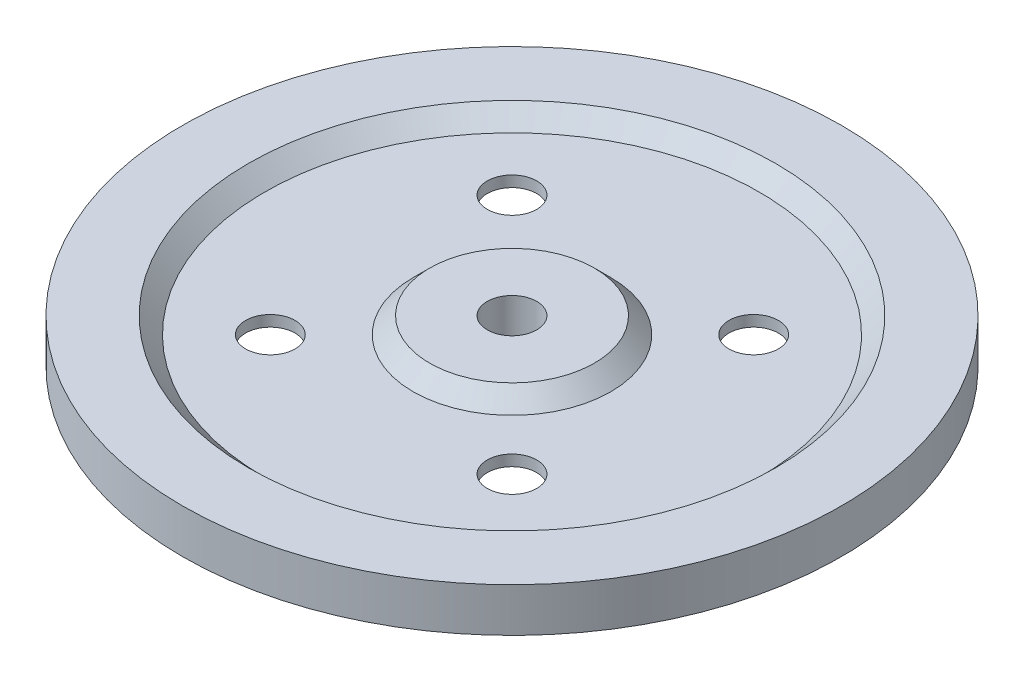
ISO-10303-21;
HEADER;
FILE_DESCRIPTION(('STEP AP214'),'2;1');
FILE_NAME('part.step','',(''),(''),'','','');
FILE_SCHEMA(('AUTOMOTIVE_DESIGN { 1 0 10303 214 1 1 1 1 }'));
ENDSEC;
DATA;
#1=APPLICATION_CONTEXT('core data for automotive mechanical design processes');
#2=APPLICATION_PROTOCOL_DEFINITION('international standard','automotive_design',2000,#1);
#3=PRODUCT_CONTEXT('',#1,'mechanical');
#4=PRODUCT('Part','Part','',(#3));
#5=PRODUCT_RELATED_PRODUCT_CATEGORY('part','',(#4));
#6=PRODUCT_DEFINITION_FORMATION('','',#4);
#7=PRODUCT_DEFINITION_CONTEXT('part definition',#1,'design');
#8=PRODUCT_DEFINITION('design','',#6,#7);
#9=PRODUCT_DEFINITION_SHAPE('','',#8);
#10=(LENGTH_UNIT() NAMED_UNIT(*) SI_UNIT(.MILLI.,.METRE.));
#11=(NAMED_UNIT(*) PLANE_ANGLE_UNIT() SI_UNIT($,.RADIAN.));
#12=(NAMED_UNIT(*) SI_UNIT($,.STERADIAN.) SOLID_ANGLE_UNIT());
#13=UNCERTAINTY_MEASURE_WITH_UNIT(LENGTH_MEASURE(1.E-05),#10,'distance_accuracy_value','');
#14=(GEOMETRIC_REPRESENTATION_CONTEXT(3) GLOBAL_UNCERTAINTY_ASSIGNED_CONTEXT((#13)) GLOBAL_UNIT_ASSIGNED_CONTEXT((#10,
#11,#12)) REPRESENTATION_CONTEXT('',''));
#15=CARTESIAN_POINT('',(0.,0.,0.));
#16=DIRECTION('',(0.,0.,1.));
#17=DIRECTION('',(1.,0.,0.));
#18=AXIS2_PLACEMENT_3D('',#15,#16,#17);
#19=CARTESIAN_POINT('',(0.,20.,0.));
#20=DIRECTION('',(0.,-1.,0.));
#21=DIRECTION('',(0.,0.,-1.));
#22=AXIS2_PLACEMENT_3D('',#19,#20,#21);
#23=CYLINDRICAL_SURFACE('',#22,300.);
#24=CARTESIAN_POINT('',(0.,20.,0.));
#25=DIRECTION('',(0.,1.,0.));
#26=DIRECTION('',(0.,0.,1.));
#27=AXIS2_PLACEMENT_3D('',#24,#25,#26);
#28=CIRCLE('',#27,300.);
#29=CARTESIAN_POINT('',(0.,20.,300.));
#30=VERTEX_POINT('',#29);
#31=EDGE_CURVE('E99',#30,#30,#28,.T.);
#32=ORIENTED_EDGE('',*,*,#31,.F.);
#33=EDGE_LOOP('',(#32));
#34=FACE_BOUND('',#33,.T.);
#35=CARTESIAN_POINT('',(0.,-20.,0.));
#36=DIRECTION('',(0.,1.,0.));
#37=DIRECTION('',(0.,0.,1.));
#38=AXIS2_PLACEMENT_3D('',#35,#36,#37);
#39=CIRCLE('',#38,300.);
#40=CARTESIAN_POINT('',(0.,-20.,300.));
#41=VERTEX_POINT('',#40);
#42=EDGE_CURVE('E100',#41,#41,#39,.T.);
#43=ORIENTED_EDGE('',*,*,#42,.T.);
#44=EDGE_LOOP('',(#43));
#45=FACE_BOUND('',#44,.T.);
#46=ADVANCED_FACE('F50',(#34,#45),#23,.T.);
#47=CARTESIAN_POINT('',(0.,20.,0.));
#48=DIRECTION('',(0.,1.,0.));
#49=DIRECTION('',(0.,0.,1.));
#50=AXIS2_PLACEMENT_3D('',#47,#48,#49);
#51=PLANE('',#50);
#52=CARTESIAN_POINT('',(0.,20.,0.));
#53=DIRECTION('',(0.,1.,0.));
#54=DIRECTION('',(0.,0.,1.));
#55=AXIS2_PLACEMENT_3D('',#52,#53,#54);
#56=CIRCLE('',#55,240.);
#57=CARTESIAN_POINT('',(0.,20.,240.));
#58=VERTEX_POINT('',#57);
#59=EDGE_CURVE('E57',#58,#58,#56,.F.);
#60=ORIENTED_EDGE('',*,*,#59,.T.);
#61=EDGE_LOOP('',(#60));
#62=FACE_BOUND('',#61,.T.);
#63=ORIENTED_EDGE('',*,*,#31,.T.);
#64=EDGE_LOOP('',(#63));
#65=FACE_BOUND('',#64,.T.);
#66=ADVANCED_FACE('F135',(#62,#65),#51,.T.);
#67=CARTESIAN_POINT('',(0.,-20.,0.));
#68=DIRECTION('',(0.,1.,0.));
#69=DIRECTION('',(0.,0.,1.));
#70=AXIS2_PLACEMENT_3D('',#67,#68,#69);
#71=PLANE('',#70);
#72=CARTESIAN_POINT('',(0.,-20.,0.));
#73=DIRECTION('',(0.,1.,0.));
#74=DIRECTION('',(0.,0.,1.));
#75=AXIS2_PLACEMENT_3D('',#72,#73,#74);
#76=CIRCLE('',#75,240.);
#77=CARTESIAN_POINT('',(0.,-20.,240.));
#78=VERTEX_POINT('',#77);
#79=EDGE_CURVE('E62',#78,#78,#76,.T.);
#80=ORIENTED_EDGE('',*,*,#79,.T.);
#81=EDGE_LOOP('',(#80));
#82=FACE_BOUND('',#81,.T.);
#83=ORIENTED_EDGE('',*,*,#42,.F.);
#84=EDGE_LOOP('',(#83));
#85=FACE_BOUND('',#84,.T.);
#86=ADVANCED_FACE('F113',(#82,#85),#71,.F.);
#87=CARTESIAN_POINT('',(0.,-5.,0.));
#88=DIRECTION('',(0.,1.,0.));
#89=DIRECTION('',(0.,0.,1.));
#90=AXIS2_PLACEMENT_3D('',#87,#88,#89);
#91=PLANE('',#90);
#92=CARTESIAN_POINT('',(-110.,-5.,110.));
#93=DIRECTION('',(0.,1.,0.));
#94=DIRECTION('',(0.,0.,1.));
#95=AXIS2_PLACEMENT_3D('',#92,#93,#94);
#96=CIRCLE('',#95,22.5);
#97=CARTESIAN_POINT('',(-110.,-5.,132.5));
#98=VERTEX_POINT('',#97);
#99=EDGE_CURVE('E90',#98,#98,#96,.T.);
#100=ORIENTED_EDGE('',*,*,#99,.T.);
#101=EDGE_LOOP('',(#100));
#102=FACE_BOUND('',#101,.T.);
#103=CARTESIAN_POINT('',(110.,-5.,110.));
#104=DIRECTION('',(0.,1.,0.));
#105=DIRECTION('',(0.,0.,1.));
#106=AXIS2_PLACEMENT_3D('',#103,#104,#105);
#107=CIRCLE('',#106,22.5);
#108=CARTESIAN_POINT('',(110.,-5.,132.5));
#109=VERTEX_POINT('',#108);
#110=EDGE_CURVE('E73',#109,#109,#107,.T.);
#111=ORIENTED_EDGE('',*,*,#110,.T.);
#112=EDGE_LOOP('',(#111));
#113=FACE_BOUND('',#112,.T.);
#114=CARTESIAN_POINT('',(110.,-5.,-110.));
#115=DIRECTION('',(0.,1.,0.));
#116=DIRECTION('',(0.,0.,1.));
#117=AXIS2_PLACEMENT_3D('',#114,#115,#116);
#118=CIRCLE('',#117,22.5);
#119=CARTESIAN_POINT('',(110.,-5.,-87.5));
#120=VERTEX_POINT('',#119);
#121=EDGE_CURVE('E75',#120,#120,#118,.T.);
#122=ORIENTED_EDGE('',*,*,#121,.T.);
#123=EDGE_LOOP('',(#122));
#124=FACE_BOUND('',#123,.T.);
#125=CARTESIAN_POINT('',(-110.,-5.,-110.));
#126=DIRECTION('',(0.,1.,0.));
#127=DIRECTION('',(0.,0.,1.));
#128=AXIS2_PLACEMENT_3D('',#125,#126,#127);
#129=CIRCLE('',#128,22.5);
#130=CARTESIAN_POINT('',(-110.,-5.,-87.5));
#131=VERTEX_POINT('',#130);
#132=EDGE_CURVE('E67',#131,#131,#129,.T.);
#133=ORIENTED_EDGE('',*,*,#132,.T.);
#134=EDGE_LOOP('',(#133));
#135=FACE_BOUND('',#134,.T.);
#136=CARTESIAN_POINT('',(0.,-5.,0.));
#137=DIRECTION('',(0.,1.,0.));
#138=DIRECTION('',(0.,0.,1.));
#139=AXIS2_PLACEMENT_3D('',#136,#137,#138);
#140=CIRCLE('',#139,90.);
#141=CARTESIAN_POINT('',(0.,-5.,90.));
#142=VERTEX_POINT('',#141);
#143=EDGE_CURVE('E92',#142,#142,#140,.F.);
#144=ORIENTED_EDGE('',*,*,#143,.F.);
#145=EDGE_LOOP('',(#144));
#146=FACE_BOUND('',#145,.T.);
#147=CARTESIAN_POINT('',(0.,-5.,0.));
#148=DIRECTION('',(0.,1.,0.));
#149=DIRECTION('',(0.,0.,1.));
#150=AXIS2_PLACEMENT_3D('',#147,#148,#149);
#151=CIRCLE('',#150,225.);
#152=CARTESIAN_POINT('',(0.,-5.,225.));
#153=VERTEX_POINT('',#152);
#154=EDGE_CURVE('E98',#153,#153,#151,.T.);
#155=ORIENTED_EDGE('',*,*,#154,.F.);
#156=EDGE_LOOP('',(#155));
#157=FACE_BOUND('',#156,.T.);
#158=ADVANCED_FACE('F153',(#102,#113,#124,#135,#146,#157),#91,.F.);
#159=CARTESIAN_POINT('',(0.,5.,0.));
#160=DIRECTION('',(0.,1.,0.));
#161=DIRECTION('',(0.,0.,1.));
#162=AXIS2_PLACEMENT_3D('',#159,#160,#161);
#163=PLANE('',#162);
#164=CARTESIAN_POINT('',(-110.,5.,110.));
#165=DIRECTION('',(0.,1.,0.));
#166=DIRECTION('',(0.,0.,1.));
#167=AXIS2_PLACEMENT_3D('',#164,#165,#166);
#168=CIRCLE('',#167,22.5);
#169=CARTESIAN_POINT('',(-110.,5.,132.5));
#170=VERTEX_POINT('',#169);
#171=EDGE_CURVE('E55',#170,#170,#168,.T.);
#172=ORIENTED_EDGE('',*,*,#171,.F.);
#173=EDGE_LOOP('',(#172));
#174=FACE_BOUND('',#173,.T.);
#175=CARTESIAN_POINT('',(110.,5.,110.));
#176=DIRECTION('',(0.,1.,0.));
#177=DIRECTION('',(0.,0.,1.));
#178=AXIS2_PLACEMENT_3D('',#175,#176,#177);
#179=CIRCLE('',#178,22.5);
#180=CARTESIAN_POINT('',(110.,5.,132.5));
#181=VERTEX_POINT('',#180);
#182=EDGE_CURVE('E74',#181,#181,#179,.T.);
#183=ORIENTED_EDGE('',*,*,#182,.F.);
#184=EDGE_LOOP('',(#183));
#185=FACE_BOUND('',#184,.T.);
#186=CARTESIAN_POINT('',(110.,5.,-110.));
#187=DIRECTION('',(0.,1.,0.));
#188=DIRECTION('',(0.,0.,1.));
#189=AXIS2_PLACEMENT_3D('',#186,#187,#188);
#190=CIRCLE('',#189,22.5);
#191=CARTESIAN_POINT('',(110.,5.,-87.5));
#192=VERTEX_POINT('',#191);
#193=EDGE_CURVE('E69',#192,#192,#190,.T.);
#194=ORIENTED_EDGE('',*,*,#193,.F.);
#195=EDGE_LOOP('',(#194));
#196=FACE_BOUND('',#195,.T.);
#197=CARTESIAN_POINT('',(-110.,5.,-110.));
#198=DIRECTION('',(0.,1.,0.));
#199=DIRECTION('',(0.,0.,1.));
#200=AXIS2_PLACEMENT_3D('',#197,#198,#199);
#201=CIRCLE('',#200,22.5);
#202=CARTESIAN_POINT('',(-110.,5.,-87.5));
#203=VERTEX_POINT('',#202);
#204=EDGE_CURVE('E63',#203,#203,#201,.T.);
#205=ORIENTED_EDGE('',*,*,#204,.F.);
#206=EDGE_LOOP('',(#205));
#207=FACE_BOUND('',#206,.T.);
#208=CARTESIAN_POINT('',(0.,5.,0.));
#209=DIRECTION('',(0.,1.,0.));
#210=DIRECTION('',(0.,0.,1.));
#211=AXIS2_PLACEMENT_3D('',#208,#209,#210);
#212=CIRCLE('',#211,90.);
#213=CARTESIAN_POINT('',(0.,5.,-89.9999999999998));
#214=VERTEX_POINT('',#213);
#215=EDGE_CURVE('E89',#214,#214,#212,.F.);
#216=ORIENTED_EDGE('',*,*,#215,.T.);
#217=EDGE_LOOP('',(#216));
#218=FACE_BOUND('',#217,.T.);
#219=CARTESIAN_POINT('',(0.,5.,0.));
#220=DIRECTION('',(0.,1.,0.));
#221=DIRECTION('',(0.,0.,1.));
#222=AXIS2_PLACEMENT_3D('',#219,#220,#221);
#223=CIRCLE('',#222,225.);
#224=CARTESIAN_POINT('',(0.,5.,225.));
#225=VERTEX_POINT('',#224);
#226=EDGE_CURVE('E93',#225,#225,#223,.T.);
#227=ORIENTED_EDGE('',*,*,#226,.T.);
#228=EDGE_LOOP('',(#227));
#229=FACE_BOUND('',#228,.T.);
#230=ADVANCED_FACE('F159',(#174,#185,#196,#207,#218,#229),#163,.T.);
#231=CARTESIAN_POINT('',(0.,20.,0.));
#232=DIRECTION('',(0.,1.,0.));
#233=DIRECTION('',(0.,0.,1.));
#234=AXIS2_PLACEMENT_3D('',#231,#232,#233);
#235=PLANE('',#234);
#236=CARTESIAN_POINT('',(0.,20.,0.));
#237=DIRECTION('',(0.,1.,0.));
#238=DIRECTION('',(0.,0.,1.));
#239=AXIS2_PLACEMENT_3D('',#236,#237,#238);
#240=CIRCLE('',#239,22.5);
#241=CARTESIAN_POINT('',(0.,20.,22.5));
#242=VERTEX_POINT('',#241);
#243=EDGE_CURVE('E314',#242,#242,#240,.T.);
#244=ORIENTED_EDGE('',*,*,#243,.F.);
#245=EDGE_LOOP('',(#244));
#246=FACE_BOUND('',#245,.T.);
#247=CARTESIAN_POINT('',(0.,20.,0.));
#248=DIRECTION('',(0.,1.,0.));
#249=DIRECTION('',(0.,0.,1.));
#250=AXIS2_PLACEMENT_3D('',#247,#248,#249);
#251=CIRCLE('',#250,74.9999999999998);
#252=CARTESIAN_POINT('',(0.,20.,-74.9999999999998));
#253=VERTEX_POINT('',#252);
#254=EDGE_CURVE('E11',#253,#253,#251,.T.);
#255=ORIENTED_EDGE('',*,*,#254,.T.);
#256=EDGE_LOOP('',(#255));
#257=FACE_BOUND('',#256,.T.);
#258=ADVANCED_FACE('F162',(#246,#257),#235,.T.);
#259=CARTESIAN_POINT('',(0.,-20.,0.));
#260=DIRECTION('',(0.,1.,0.));
#261=DIRECTION('',(0.,0.,1.));
#262=AXIS2_PLACEMENT_3D('',#259,#260,#261);
#263=PLANE('',#262);
#264=CARTESIAN_POINT('',(0.,-20.,0.));
#265=DIRECTION('',(0.,1.,0.));
#266=DIRECTION('',(0.,0.,1.));
#267=AXIS2_PLACEMENT_3D('',#264,#265,#266);
#268=CIRCLE('',#267,22.5);
#269=CARTESIAN_POINT('',(0.,-20.,22.5));
#270=VERTEX_POINT('',#269);
#271=EDGE_CURVE('E68',#270,#270,#268,.T.);
#272=ORIENTED_EDGE('',*,*,#271,.T.);
#273=EDGE_LOOP('',(#272));
#274=FACE_BOUND('',#273,.T.);
#275=CARTESIAN_POINT('',(0.,-20.,0.));
#276=DIRECTION('',(0.,1.,0.));
#277=DIRECTION('',(0.,0.,1.));
#278=AXIS2_PLACEMENT_3D('',#275,#276,#277);
#279=CIRCLE('',#278,74.9999999999999);
#280=CARTESIAN_POINT('',(0.,-20.,74.9999999999999));
#281=VERTEX_POINT('',#280);
#282=EDGE_CURVE('E91',#281,#281,#279,.F.);
#283=ORIENTED_EDGE('',*,*,#282,.T.);
#284=EDGE_LOOP('',(#283));
#285=FACE_BOUND('',#284,.T.);
#286=ADVANCED_FACE('F130',(#274,#285),#263,.F.);
#287=CARTESIAN_POINT('',(0.,-4.99999999999993,0.));
#288=DIRECTION('',(0.,1.,0.));
#289=DIRECTION('',(0.,0.,1.));
#290=AXIS2_PLACEMENT_3D('',#287,#288,#289);
#291=CONICAL_SURFACE('',#290,90.,0.785398163397448);
#292=ORIENTED_EDGE('',*,*,#282,.F.);
#293=EDGE_LOOP('',(#292));
#294=FACE_BOUND('',#293,.T.);
#295=ORIENTED_EDGE('',*,*,#143,.T.);
#296=EDGE_LOOP('',(#295));
#297=FACE_BOUND('',#296,.T.);
#298=ADVANCED_FACE('F118',(#294,#297),#291,.T.);
#299=CARTESIAN_POINT('',(0.,-20.,0.));
#300=DIRECTION('',(0.,-1.,0.));
#301=DIRECTION('',(0.,0.,-1.));
#302=AXIS2_PLACEMENT_3D('',#299,#300,#301);
#303=CONICAL_SURFACE('',#302,240.,0.785398163397447);
#304=ORIENTED_EDGE('',*,*,#154,.T.);
#305=EDGE_LOOP('',(#304));
#306=FACE_BOUND('',#305,.T.);
#307=ORIENTED_EDGE('',*,*,#79,.F.);
#308=EDGE_LOOP('',(#307));
#309=FACE_BOUND('',#308,.T.);
#310=ADVANCED_FACE('F116',(#306,#309),#303,.F.);
#311=CARTESIAN_POINT('',(0.,4.9999999999999,0.));
#312=DIRECTION('',(0.,1.,0.));
#313=DIRECTION('',(0.,0.,1.));
#314=AXIS2_PLACEMENT_3D('',#311,#312,#313);
#315=CONICAL_SURFACE('',#314,225.,0.785398163397448);
#316=CARTESIAN_POINT('',(0.,20.,240.));
#317=CARTESIAN_POINT('',(0.,19.84375,239.84375));
#318=CARTESIAN_POINT('',(0.,19.6875,239.6875));
#319=CARTESIAN_POINT('',(0.,19.375,239.375));
#320=CARTESIAN_POINT('',(0.,19.21875,239.21875));
#321=CARTESIAN_POINT('',(0.,18.90625,238.90625));
#322=CARTESIAN_POINT('',(0.,18.75,238.75));
#323=CARTESIAN_POINT('',(0.,18.4375,238.4375));
#324=CARTESIAN_POINT('',(0.,18.28125,238.28125));
#325=CARTESIAN_POINT('',(0.,17.96875,237.96875));
#326=CARTESIAN_POINT('',(0.,17.8125,237.8125));
#327=CARTESIAN_POINT('',(0.,17.5,237.5));
#328=CARTESIAN_POINT('',(0.,17.34375,237.34375));
#329=CARTESIAN_POINT('',(0.,17.03125,237.03125));
#330=CARTESIAN_POINT('',(0.,16.875,236.875));
#331=CARTESIAN_POINT('',(0.,16.5625,236.5625));
#332=CARTESIAN_POINT('',(0.,16.40625,236.40625));
#333=CARTESIAN_POINT('',(0.,16.09375,236.09375));
#334=CARTESIAN_POINT('',(0.,15.9375,235.9375));
#335=CARTESIAN_POINT('',(0.,15.625,235.625));
#336=CARTESIAN_POINT('',(0.,15.46875,235.46875));
#337=CARTESIAN_POINT('',(0.,15.15625,235.15625));
#338=CARTESIAN_POINT('',(0.,15.,235.));
#339=CARTESIAN_POINT('',(0.,14.6875,234.6875));
#340=CARTESIAN_POINT('',(0.,14.53125,234.53125));
#341=CARTESIAN_POINT('',(0.,14.21875,234.21875));
#342=CARTESIAN_POINT('',(0.,14.0625,234.0625));
#343=CARTESIAN_POINT('',(0.,13.75,233.75));
#344=CARTESIAN_POINT('',(0.,13.59375,233.59375));
#345=CARTESIAN_POINT('',(0.,13.28125,233.28125));
#346=CARTESIAN_POINT('',(0.,13.125,233.125));
#347=CARTESIAN_POINT('',(0.,12.8125,232.8125));
#348=CARTESIAN_POINT('',(0.,12.65625,232.65625));
#349=CARTESIAN_POINT('',(0.,12.34375,232.34375));
#350=CARTESIAN_POINT('',(0.,12.1875,232.1875));
#351=CARTESIAN_POINT('',(0.,11.875,231.875));
#352=CARTESIAN_POINT('',(0.,11.71875,231.71875));
#353=CARTESIAN_POINT('',(0.,11.40625,231.40625));
#354=CARTESIAN_POINT('',(0.,11.25,231.25));
#355=CARTESIAN_POINT('',(0.,10.9375,230.9375));
#356=CARTESIAN_POINT('',(0.,10.78125,230.78125));
#357=CARTESIAN_POINT('',(0.,10.46875,230.46875));
#358=CARTESIAN_POINT('',(0.,10.3125,230.3125));
#359=CARTESIAN_POINT('',(0.,10.,230.));
#360=CARTESIAN_POINT('',(0.,9.84375,229.84375));
#361=CARTESIAN_POINT('',(0.,9.53125,229.53125));
#362=CARTESIAN_POINT('',(0.,9.375,229.375));
#363=CARTESIAN_POINT('',(0.,9.0625,229.0625));
#364=CARTESIAN_POINT('',(0.,8.90625,228.90625));
#365=CARTESIAN_POINT('',(0.,8.59375,228.59375));
#366=CARTESIAN_POINT('',(0.,8.4375,228.4375));
#367=CARTESIAN_POINT('',(0.,8.125,228.125));
#368=CARTESIAN_POINT('',(0.,7.96875,227.96875));
#369=CARTESIAN_POINT('',(0.,7.65625,227.65625));
#370=CARTESIAN_POINT('',(0.,7.5,227.5));
#371=CARTESIAN_POINT('',(0.,7.1875,227.1875));
#372=CARTESIAN_POINT('',(0.,7.03125,227.03125));
#373=CARTESIAN_POINT('',(0.,6.71875,226.71875));
#374=CARTESIAN_POINT('',(0.,6.5625,226.5625));
#375=CARTESIAN_POINT('',(0.,6.25,226.25));
#376=CARTESIAN_POINT('',(0.,6.09375,226.09375));
#377=CARTESIAN_POINT('',(0.,5.78125,225.78125));
#378=CARTESIAN_POINT('',(0.,5.625,225.625));
#379=CARTESIAN_POINT('',(0.,5.3125,225.3125));
#380=CARTESIAN_POINT('',(0.,5.15624999999999,225.15625));
#381=CARTESIAN_POINT('',(0.,5.,225.));
#382=B_SPLINE_CURVE_WITH_KNOTS('',3,(#316,#317,#318,#319,#320,#321,#322,#323,#324,#325,#326,
#327,#328,#329,#330,#331,#332,#333,#334,#335,#336,#337,#338,#339,#340,#341,#342,#343,#344,#345,
#346,#347,#348,#349,#350,#351,#352,#353,#354,#355,#356,#357,#358,#359,#360,#361,#362,#363,#364,
#365,#366,#367,#368,#369,#370,#371,#372,#373,#374,#375,#376,#377,#378,#379,#380,#381),
.UNSPECIFIED.,.F.,.F.,(4,2,2,2,2,2,2,2,2,2,2,2,2,2,2,2,2,2,2,2,2,2,2,2,2,2,2,2,2,2,2,2,4),(0.,
0.662912607362379,1.32582521472478,1.98873782208716,2.65165042944954,3.31456303681194,
3.97747564417432,4.64038825153673,5.30330085889911,5.96621346626149,6.62912607362389,
7.29203868098627,7.95495128834865,8.61786389571105,9.28077650307343,9.94368911043581,
10.6066017177982,11.2695143251606,11.932426932523,12.5953395398854,13.2582521472478,
13.9211647546102,14.5840773619725,15.2469899693349,15.9099025766973,16.5728151840597,
17.2357277914221,17.8986403987845,18.5615530061469,19.2244656135092,19.8873782208716,
20.550290828234,21.2132034355964),.UNSPECIFIED.);
#383=EDGE_CURVE('BSEAM117',#58,#225,#382,.T.);
#384=ORIENTED_EDGE('',*,*,#59,.F.);
#385=ORIENTED_EDGE('',*,*,#226,.F.);
#386=ORIENTED_EDGE('',*,*,#383,.T.);
#387=ORIENTED_EDGE('',*,*,#383,.F.);
#388=EDGE_LOOP('',(#384,#386,#385,#387));
#389=FACE_BOUND('',#388,.T.);
#390=ADVANCED_FACE('F117',(#389),#315,.F.);
#391=CARTESIAN_POINT('',(0.,20.,0.));
#392=DIRECTION('',(0.,-1.,0.));
#393=DIRECTION('',(0.,0.,-1.));
#394=AXIS2_PLACEMENT_3D('',#391,#392,#393);
#395=CONICAL_SURFACE('',#394,74.9999999999998,0.785398163397447);
#396=CARTESIAN_POINT('',(0.,5.,-89.9999999999998));
#397=CARTESIAN_POINT('',(0.,5.15625,-89.8437499999998));
#398=CARTESIAN_POINT('',(0.,5.3125,-89.6874999999998));
#399=CARTESIAN_POINT('',(0.,5.625,-89.3749999999998));
#400=CARTESIAN_POINT('',(0.,5.78125,-89.2187499999998));
#401=CARTESIAN_POINT('',(0.,6.09375,-88.9062499999998));
#402=CARTESIAN_POINT('',(0.,6.25,-88.7499999999998));
#403=CARTESIAN_POINT('',(0.,6.5625,-88.4374999999998));
#404=CARTESIAN_POINT('',(0.,6.71875,-88.2812499999998));
#405=CARTESIAN_POINT('',(0.,7.03125,-87.9687499999998));
#406=CARTESIAN_POINT('',(0.,7.1875,-87.8124999999998));
#407=CARTESIAN_POINT('',(0.,7.5,-87.4999999999998));
#408=CARTESIAN_POINT('',(0.,7.65625,-87.3437499999998));
#409=CARTESIAN_POINT('',(0.,7.96875,-87.0312499999998));
#410=CARTESIAN_POINT('',(0.,8.125,-86.8749999999998));
#411=CARTESIAN_POINT('',(0.,8.4375,-86.5624999999998));
#412=CARTESIAN_POINT('',(0.,8.59375,-86.4062499999998));
#413=CARTESIAN_POINT('',(0.,8.90625,-86.0937499999998));
#414=CARTESIAN_POINT('',(0.,9.0625,-85.9374999999998));
#415=CARTESIAN_POINT('',(0.,9.375,-85.6249999999998));
#416=CARTESIAN_POINT('',(0.,9.53125,-85.4687499999998));
#417=CARTESIAN_POINT('',(0.,9.84375,-85.1562499999998));
#418=CARTESIAN_POINT('',(0.,10.,-84.9999999999998));
#419=CARTESIAN_POINT('',(0.,10.3125,-84.6874999999998));
#420=CARTESIAN_POINT('',(0.,10.46875,-84.5312499999998));
#421=CARTESIAN_POINT('',(0.,10.78125,-84.2187499999998));
#422=CARTESIAN_POINT('',(0.,10.9375,-84.0624999999998));
#423=CARTESIAN_POINT('',(0.,11.25,-83.7499999999998));
#424=CARTESIAN_POINT('',(0.,11.40625,-83.5937499999998));
#425=CARTESIAN_POINT('',(0.,11.71875,-83.2812499999998));
#426=CARTESIAN_POINT('',(0.,11.875,-83.1249999999998));
#427=CARTESIAN_POINT('',(0.,12.1875,-82.8124999999998));
#428=CARTESIAN_POINT('',(0.,12.34375,-82.6562499999998));
#429=CARTESIAN_POINT('',(0.,12.65625,-82.3437499999998));
#430=CARTESIAN_POINT('',(0.,12.8125,-82.1874999999998));
#431=CARTESIAN_POINT('',(0.,13.125,-81.8749999999998));
#432=CARTESIAN_POINT('',(0.,13.28125,-81.7187499999998));
#433=CARTESIAN_POINT('',(0.,13.59375,-81.4062499999998));
#434=CARTESIAN_POINT('',(0.,13.75,-81.2499999999998));
#435=CARTESIAN_POINT('',(0.,14.0625,-80.9374999999998));
#436=CARTESIAN_POINT('',(0.,14.21875,-80.7812499999998));
#437=CARTESIAN_POINT('',(0.,14.53125,-80.4687499999998));
#438=CARTESIAN_POINT('',(0.,14.6875,-80.3124999999998));
#439=CARTESIAN_POINT('',(0.,15.,-79.9999999999998));
#440=CARTESIAN_POINT('',(0.,15.15625,-79.8437499999998));
#441=CARTESIAN_POINT('',(0.,15.46875,-79.5312499999998));
#442=CARTESIAN_POINT('',(0.,15.625,-79.3749999999998));
#443=CARTESIAN_POINT('',(0.,15.9375,-79.0624999999998));
#444=CARTESIAN_POINT('',(0.,16.09375,-78.9062499999998));
#445=CARTESIAN_POINT('',(0.,16.40625,-78.5937499999998));
#446=CARTESIAN_POINT('',(0.,16.5625,-78.4374999999998));
#447=CARTESIAN_POINT('',(0.,16.875,-78.1249999999998));
#448=CARTESIAN_POINT('',(0.,17.03125,-77.9687499999998));
#449=CARTESIAN_POINT('',(0.,17.34375,-77.6562499999998));
#450=CARTESIAN_POINT('',(0.,17.5,-77.4999999999998));
#451=CARTESIAN_POINT('',(0.,17.8125,-77.1874999999998));
#452=CARTESIAN_POINT('',(0.,17.96875,-77.0312499999998));
#453=CARTESIAN_POINT('',(0.,18.28125,-76.7187499999998));
#454=CARTESIAN_POINT('',(0.,18.4375,-76.5624999999998));
#455=CARTESIAN_POINT('',(0.,18.75,-76.2499999999998));
#456=CARTESIAN_POINT('',(0.,18.90625,-76.0937499999998));
#457=CARTESIAN_POINT('',(0.,19.21875,-75.7812499999998));
#458=CARTESIAN_POINT('',(0.,19.375,-75.6249999999998));
#459=CARTESIAN_POINT('',(0.,19.6875,-75.3124999999998));
#460=CARTESIAN_POINT('',(0.,19.84375,-75.1562499999998));
#461=CARTESIAN_POINT('',(0.,20.,-74.9999999999998));
#462=B_SPLINE_CURVE_WITH_KNOTS('',3,(#396,#397,#398,#399,#400,#401,#402,#403,#404,#405,#406,
#407,#408,#409,#410,#411,#412,#413,#414,#415,#416,#417,#418,#419,#420,#421,#422,#423,#424,#425,
#426,#427,#428,#429,#430,#431,#432,#433,#434,#435,#436,#437,#438,#439,#440,#441,#442,#443,#444,
#445,#446,#447,#448,#449,#450,#451,#452,#453,#454,#455,#456,#457,#458,#459,#460,#461),
.UNSPECIFIED.,.F.,.F.,(4,2,2,2,2,2,2,2,2,2,2,2,2,2,2,2,2,2,2,2,2,2,2,2,2,2,2,2,2,2,2,2,4),(0.,
0.662912607362382,1.32582521472477,1.98873782208716,2.65165042944954,3.31456303681194,
3.97747564417433,4.64038825153671,5.3033008588991,5.96621346626148,6.62912607362387,
7.29203868098626,7.95495128834864,8.61786389571103,9.28077650307342,9.94368911043581,
10.6066017177982,11.2695143251606,11.932426932523,12.5953395398854,13.2582521472477,
13.9211647546101,14.5840773619725,15.2469899693349,15.9099025766973,16.5728151840597,
17.2357277914221,17.8986403987845,18.5615530061468,19.2244656135092,19.8873782208716,
20.550290828234,21.2132034355964),.UNSPECIFIED.);
#463=EDGE_CURVE('BSEAM49',#214,#253,#462,.T.);
#464=ORIENTED_EDGE('',*,*,#215,.F.);
#465=ORIENTED_EDGE('',*,*,#254,.F.);
#466=ORIENTED_EDGE('',*,*,#463,.T.);
#467=ORIENTED_EDGE('',*,*,#463,.F.);
#468=EDGE_LOOP('',(#464,#466,#465,#467));
#469=FACE_BOUND('',#468,.T.);
#470=ADVANCED_FACE('F49',(#469),#395,.T.);
#471=CARTESIAN_POINT('',(0.,-20.,0.));
#472=DIRECTION('',(0.,1.,0.));
#473=DIRECTION('',(0.,0.,1.));
#474=AXIS2_PLACEMENT_3D('',#471,#472,#473);
#475=CYLINDRICAL_SURFACE('',#474,22.5);
#476=ORIENTED_EDGE('',*,*,#271,.F.);
#477=EDGE_LOOP('',(#476));
#478=FACE_BOUND('',#477,.T.);
#479=ORIENTED_EDGE('',*,*,#243,.T.);
#480=EDGE_LOOP('',(#479));
#481=FACE_BOUND('',#480,.T.);
#482=ADVANCED_FACE('F167',(#478,#481),#475,.F.);
#483=CARTESIAN_POINT('',(-110.,-20.,-110.));
#484=DIRECTION('',(0.,1.,0.));
#485=DIRECTION('',(0.,0.,1.));
#486=AXIS2_PLACEMENT_3D('',#483,#484,#485);
#487=CYLINDRICAL_SURFACE('',#486,22.5);
#488=ORIENTED_EDGE('',*,*,#204,.T.);
#489=EDGE_LOOP('',(#488));
#490=FACE_BOUND('',#489,.T.);
#491=ORIENTED_EDGE('',*,*,#132,.F.);
#492=EDGE_LOOP('',(#491));
#493=FACE_BOUND('',#492,.T.);
#494=ADVANCED_FACE('F173',(#490,#493),#487,.F.);
#495=CARTESIAN_POINT('',(110.,-20.,-110.));
#496=DIRECTION('',(0.,1.,0.));
#497=DIRECTION('',(0.,0.,1.));
#498=AXIS2_PLACEMENT_3D('',#495,#496,#497);
#499=CYLINDRICAL_SURFACE('',#498,22.5);
#500=ORIENTED_EDGE('',*,*,#193,.T.);
#501=EDGE_LOOP('',(#500));
#502=FACE_BOUND('',#501,.T.);
#503=ORIENTED_EDGE('',*,*,#121,.F.);
#504=EDGE_LOOP('',(#503));
#505=FACE_BOUND('',#504,.T.);
#506=ADVANCED_FACE('F185',(#502,#505),#499,.F.);
#507=CARTESIAN_POINT('',(110.,-20.,110.));
#508=DIRECTION('',(0.,1.,0.));
#509=DIRECTION('',(0.,0.,1.));
#510=AXIS2_PLACEMENT_3D('',#507,#508,#509);
#511=CYLINDRICAL_SURFACE('',#510,22.5);
#512=ORIENTED_EDGE('',*,*,#182,.T.);
#513=EDGE_LOOP('',(#512));
#514=FACE_BOUND('',#513,.T.);
#515=ORIENTED_EDGE('',*,*,#110,.F.);
#516=EDGE_LOOP('',(#515));
#517=FACE_BOUND('',#516,.T.);
#518=ADVANCED_FACE('F178',(#514,#517),#511,.F.);
#519=CARTESIAN_POINT('',(-110.,-20.,110.));
#520=DIRECTION('',(0.,1.,0.));
#521=DIRECTION('',(0.,0.,1.));
#522=AXIS2_PLACEMENT_3D('',#519,#520,#521);
#523=CYLINDRICAL_SURFACE('',#522,22.5);
#524=ORIENTED_EDGE('',*,*,#171,.T.);
#525=EDGE_LOOP('',(#524));
#526=FACE_BOUND('',#525,.T.);
#527=ORIENTED_EDGE('',*,*,#99,.F.);
#528=EDGE_LOOP('',(#527));
#529=FACE_BOUND('',#528,.T.);
#530=ADVANCED_FACE('F174',(#526,#529),#523,.F.);
#531=CLOSED_SHELL('',(#46,#66,#86,#158,#230,#258,#286,#298,#310,#390,#470,#482,#494,#506,#518,#530));
#532=MANIFOLD_SOLID_BREP('B2',#531);
#533=ADVANCED_BREP_SHAPE_REPRESENTATION('',(#18,#532),#14);
#534=SHAPE_DEFINITION_REPRESENTATION(#9,#533);
ENDSEC;
END-ISO-10303-21;
